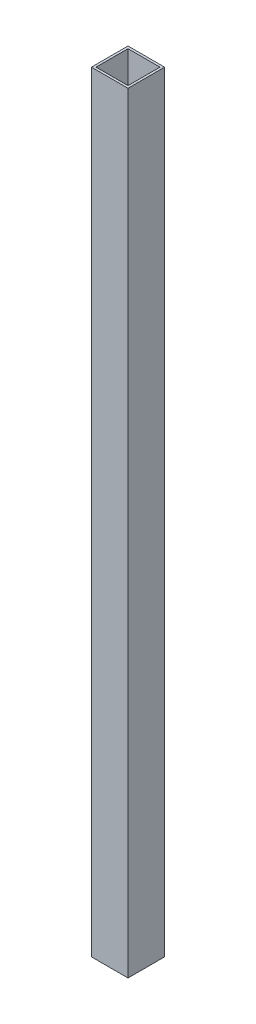
ISO-10303-21;
HEADER;
FILE_DESCRIPTION(('STEP AP214'),'2;1');
FILE_NAME('part.step','',(''),(''),'','','');
FILE_SCHEMA(('AUTOMOTIVE_DESIGN { 1 0 10303 214 1 1 1 1 }'));
ENDSEC;
DATA;
#1=APPLICATION_CONTEXT('core data for automotive mechanical design processes');
#2=APPLICATION_PROTOCOL_DEFINITION('international standard','automotive_design',2000,#1);
#3=PRODUCT_CONTEXT('',#1,'mechanical');
#4=PRODUCT('Part','Part','',(#3));
#5=PRODUCT_RELATED_PRODUCT_CATEGORY('part','',(#4));
#6=PRODUCT_DEFINITION_FORMATION('','',#4);
#7=PRODUCT_DEFINITION_CONTEXT('part definition',#1,'design');
#8=PRODUCT_DEFINITION('design','',#6,#7);
#9=PRODUCT_DEFINITION_SHAPE('','',#8);
#10=(LENGTH_UNIT() NAMED_UNIT(*) SI_UNIT(.MILLI.,.METRE.));
#11=(NAMED_UNIT(*) PLANE_ANGLE_UNIT() SI_UNIT($,.RADIAN.));
#12=(NAMED_UNIT(*) SI_UNIT($,.STERADIAN.) SOLID_ANGLE_UNIT());
#13=UNCERTAINTY_MEASURE_WITH_UNIT(LENGTH_MEASURE(1.E-05),#10,'distance_accuracy_value','');
#14=(GEOMETRIC_REPRESENTATION_CONTEXT(3) GLOBAL_UNCERTAINTY_ASSIGNED_CONTEXT((#13)) GLOBAL_UNIT_ASSIGNED_CONTEXT((#10,
#11,#12)) REPRESENTATION_CONTEXT('',''));
#15=CARTESIAN_POINT('',(0.,0.,0.));
#16=DIRECTION('',(0.,0.,1.));
#17=DIRECTION('',(1.,0.,0.));
#18=AXIS2_PLACEMENT_3D('',#15,#16,#17);
#19=CARTESIAN_POINT('',(0.,400.,0.));
#20=DIRECTION('',(0.,1.,0.));
#21=DIRECTION('',(0.,0.,1.));
#22=AXIS2_PLACEMENT_3D('',#19,#20,#21);
#23=PLANE('',#22);
#24=DIRECTION('',(0.,0.,1.));
#25=VECTOR('',#24,1.);
#26=CARTESIAN_POINT('',(0.,400.,0.));
#27=LINE('',#26,#25);
#28=CARTESIAN_POINT('',(0.,400.,0.));
#29=VERTEX_POINT('',#28);
#30=CARTESIAN_POINT('',(0.,400.,19.));
#31=VERTEX_POINT('',#30);
#32=EDGE_CURVE('E134',#29,#31,#27,.T.);
#33=ORIENTED_EDGE('',*,*,#32,.T.);
#34=DIRECTION('',(1.,0.,0.));
#35=VECTOR('',#34,1.);
#36=CARTESIAN_POINT('',(0.,400.,19.));
#37=LINE('',#36,#35);
#38=CARTESIAN_POINT('',(19.,400.,19.));
#39=VERTEX_POINT('',#38);
#40=EDGE_CURVE('E137',#31,#39,#37,.T.);
#41=ORIENTED_EDGE('',*,*,#40,.T.);
#42=DIRECTION('',(0.,0.,-1.));
#43=VECTOR('',#42,1.);
#44=CARTESIAN_POINT('',(19.,400.,0.));
#45=LINE('',#44,#43);
#46=CARTESIAN_POINT('',(19.,400.,0.));
#47=VERTEX_POINT('',#46);
#48=EDGE_CURVE('E140',#39,#47,#45,.T.);
#49=ORIENTED_EDGE('',*,*,#48,.T.);
#50=DIRECTION('',(-1.,0.,0.));
#51=VECTOR('',#50,1.);
#52=CARTESIAN_POINT('',(0.,400.,0.));
#53=LINE('',#52,#51);
#54=EDGE_CURVE('E142',#47,#29,#53,.T.);
#55=ORIENTED_EDGE('',*,*,#54,.T.);
#56=EDGE_LOOP('',(#33,#41,#49,#55));
#57=FACE_BOUND('',#56,.T.);
#58=DIRECTION('',(1.,0.,0.));
#59=VECTOR('',#58,1.);
#60=CARTESIAN_POINT('',(1.2,400.,17.8));
#61=LINE('',#60,#59);
#62=CARTESIAN_POINT('',(1.2,400.,17.8));
#63=VERTEX_POINT('',#62);
#64=CARTESIAN_POINT('',(17.8,400.,17.8));
#65=VERTEX_POINT('',#64);
#66=EDGE_CURVE('E106',#63,#65,#61,.T.);
#67=ORIENTED_EDGE('',*,*,#66,.F.);
#68=DIRECTION('',(0.,0.,1.));
#69=VECTOR('',#68,1.);
#70=CARTESIAN_POINT('',(1.2,400.,1.2));
#71=LINE('',#70,#69);
#72=CARTESIAN_POINT('',(1.2,400.,1.2));
#73=VERTEX_POINT('',#72);
#74=EDGE_CURVE('E98',#73,#63,#71,.T.);
#75=ORIENTED_EDGE('',*,*,#74,.F.);
#76=DIRECTION('',(-1.,0.,0.));
#77=VECTOR('',#76,1.);
#78=CARTESIAN_POINT('',(1.2,400.,1.2));
#79=LINE('',#78,#77);
#80=CARTESIAN_POINT('',(17.8,400.,1.2));
#81=VERTEX_POINT('',#80);
#82=EDGE_CURVE('E120',#81,#73,#79,.T.);
#83=ORIENTED_EDGE('',*,*,#82,.F.);
#84=DIRECTION('',(0.,0.,-1.));
#85=VECTOR('',#84,1.);
#86=CARTESIAN_POINT('',(17.8,400.,1.2));
#87=LINE('',#86,#85);
#88=EDGE_CURVE('E118',#65,#81,#87,.T.);
#89=ORIENTED_EDGE('',*,*,#88,.F.);
#90=EDGE_LOOP('',(#67,#75,#83,#89));
#91=FACE_BOUND('',#90,.T.);
#92=ADVANCED_FACE('F33',(#57,#91),#23,.T.);
#93=CARTESIAN_POINT('',(0.,0.,0.));
#94=DIRECTION('',(0.,1.,0.));
#95=DIRECTION('',(0.,0.,1.));
#96=AXIS2_PLACEMENT_3D('',#93,#94,#95);
#97=PLANE('',#96);
#98=DIRECTION('',(0.,0.,1.));
#99=VECTOR('',#98,1.);
#100=CARTESIAN_POINT('',(0.,0.,0.));
#101=LINE('',#100,#99);
#102=CARTESIAN_POINT('',(0.,0.,0.));
#103=VERTEX_POINT('',#102);
#104=CARTESIAN_POINT('',(0.,0.,19.));
#105=VERTEX_POINT('',#104);
#106=EDGE_CURVE('E114',#103,#105,#101,.T.);
#107=ORIENTED_EDGE('',*,*,#106,.F.);
#108=DIRECTION('',(-1.,0.,0.));
#109=VECTOR('',#108,1.);
#110=CARTESIAN_POINT('',(0.,0.,0.));
#111=LINE('',#110,#109);
#112=CARTESIAN_POINT('',(19.,0.,0.));
#113=VERTEX_POINT('',#112);
#114=EDGE_CURVE('E138',#113,#103,#111,.T.);
#115=ORIENTED_EDGE('',*,*,#114,.F.);
#116=DIRECTION('',(0.,0.,-1.));
#117=VECTOR('',#116,1.);
#118=CARTESIAN_POINT('',(19.,0.,0.));
#119=LINE('',#118,#117);
#120=CARTESIAN_POINT('',(19.,0.,19.));
#121=VERTEX_POINT('',#120);
#122=EDGE_CURVE('E149',#121,#113,#119,.T.);
#123=ORIENTED_EDGE('',*,*,#122,.F.);
#124=DIRECTION('',(1.,0.,0.));
#125=VECTOR('',#124,1.);
#126=CARTESIAN_POINT('',(0.,0.,19.));
#127=LINE('',#126,#125);
#128=EDGE_CURVE('E147',#105,#121,#127,.T.);
#129=ORIENTED_EDGE('',*,*,#128,.F.);
#130=EDGE_LOOP('',(#107,#115,#123,#129));
#131=FACE_BOUND('',#130,.T.);
#132=DIRECTION('',(0.,0.,1.));
#133=VECTOR('',#132,1.);
#134=CARTESIAN_POINT('',(1.2,0.,1.2));
#135=LINE('',#134,#133);
#136=CARTESIAN_POINT('',(1.2,0.,1.2));
#137=VERTEX_POINT('',#136);
#138=CARTESIAN_POINT('',(1.2,0.,17.8));
#139=VERTEX_POINT('',#138);
#140=EDGE_CURVE('E56',#137,#139,#135,.T.);
#141=ORIENTED_EDGE('',*,*,#140,.T.);
#142=DIRECTION('',(1.,0.,0.));
#143=VECTOR('',#142,1.);
#144=CARTESIAN_POINT('',(1.2,0.,17.8));
#145=LINE('',#144,#143);
#146=CARTESIAN_POINT('',(17.8,0.,17.8));
#147=VERTEX_POINT('',#146);
#148=EDGE_CURVE('E113',#139,#147,#145,.T.);
#149=ORIENTED_EDGE('',*,*,#148,.T.);
#150=DIRECTION('',(0.,0.,-1.));
#151=VECTOR('',#150,1.);
#152=CARTESIAN_POINT('',(17.8,0.,1.2));
#153=LINE('',#152,#151);
#154=CARTESIAN_POINT('',(17.8,0.,1.2));
#155=VERTEX_POINT('',#154);
#156=EDGE_CURVE('E126',#147,#155,#153,.T.);
#157=ORIENTED_EDGE('',*,*,#156,.T.);
#158=DIRECTION('',(-1.,0.,0.));
#159=VECTOR('',#158,1.);
#160=CARTESIAN_POINT('',(1.2,0.,1.2));
#161=LINE('',#160,#159);
#162=EDGE_CURVE('E107',#155,#137,#161,.T.);
#163=ORIENTED_EDGE('',*,*,#162,.T.);
#164=EDGE_LOOP('',(#141,#149,#157,#163));
#165=FACE_BOUND('',#164,.T.);
#166=ADVANCED_FACE('F167',(#131,#165),#97,.F.);
#167=CARTESIAN_POINT('',(0.,400.,0.));
#168=DIRECTION('',(1.,0.,0.));
#169=DIRECTION('',(0.,0.,-1.));
#170=AXIS2_PLACEMENT_3D('',#167,#168,#169);
#171=PLANE('',#170);
#172=ORIENTED_EDGE('',*,*,#106,.T.);
#173=DIRECTION('',(0.,-1.,0.));
#174=VECTOR('',#173,1.);
#175=CARTESIAN_POINT('',(0.,400.,19.));
#176=LINE('',#175,#174);
#177=EDGE_CURVE('E11',#31,#105,#176,.T.);
#178=ORIENTED_EDGE('',*,*,#177,.F.);
#179=ORIENTED_EDGE('',*,*,#32,.F.);
#180=DIRECTION('',(0.,-1.,0.));
#181=VECTOR('',#180,1.);
#182=CARTESIAN_POINT('',(0.,400.,0.));
#183=LINE('',#182,#181);
#184=EDGE_CURVE('E144',#29,#103,#183,.T.);
#185=ORIENTED_EDGE('',*,*,#184,.T.);
#186=EDGE_LOOP('',(#172,#178,#179,#185));
#187=FACE_BOUND('',#186,.T.);
#188=ADVANCED_FACE('F35',(#187),#171,.F.);
#189=CARTESIAN_POINT('',(0.,400.,19.));
#190=DIRECTION('',(0.,0.,-1.));
#191=DIRECTION('',(-1.,0.,0.));
#192=AXIS2_PLACEMENT_3D('',#189,#190,#191);
#193=PLANE('',#192);
#194=ORIENTED_EDGE('',*,*,#128,.T.);
#195=DIRECTION('',(0.,-1.,0.));
#196=VECTOR('',#195,1.);
#197=CARTESIAN_POINT('',(19.,400.,19.));
#198=LINE('',#197,#196);
#199=EDGE_CURVE('E41',#39,#121,#198,.T.);
#200=ORIENTED_EDGE('',*,*,#199,.F.);
#201=ORIENTED_EDGE('',*,*,#40,.F.);
#202=ORIENTED_EDGE('',*,*,#177,.T.);
#203=EDGE_LOOP('',(#194,#200,#201,#202));
#204=FACE_BOUND('',#203,.T.);
#205=ADVANCED_FACE('F177',(#204),#193,.F.);
#206=CARTESIAN_POINT('',(19.,400.,0.));
#207=DIRECTION('',(-1.,0.,0.));
#208=DIRECTION('',(0.,0.,1.));
#209=AXIS2_PLACEMENT_3D('',#206,#207,#208);
#210=PLANE('',#209);
#211=ORIENTED_EDGE('',*,*,#122,.T.);
#212=DIRECTION('',(0.,-1.,0.));
#213=VECTOR('',#212,1.);
#214=CARTESIAN_POINT('',(19.,400.,0.));
#215=LINE('',#214,#213);
#216=EDGE_CURVE('E154',#47,#113,#215,.T.);
#217=ORIENTED_EDGE('',*,*,#216,.F.);
#218=ORIENTED_EDGE('',*,*,#48,.F.);
#219=ORIENTED_EDGE('',*,*,#199,.T.);
#220=EDGE_LOOP('',(#211,#217,#218,#219));
#221=FACE_BOUND('',#220,.T.);
#222=ADVANCED_FACE('F161',(#221),#210,.F.);
#223=CARTESIAN_POINT('',(0.,400.,0.));
#224=DIRECTION('',(0.,0.,1.));
#225=DIRECTION('',(1.,0.,0.));
#226=AXIS2_PLACEMENT_3D('',#223,#224,#225);
#227=PLANE('',#226);
#228=ORIENTED_EDGE('',*,*,#114,.T.);
#229=ORIENTED_EDGE('',*,*,#184,.F.);
#230=ORIENTED_EDGE('',*,*,#54,.F.);
#231=ORIENTED_EDGE('',*,*,#216,.T.);
#232=EDGE_LOOP('',(#228,#229,#230,#231));
#233=FACE_BOUND('',#232,.T.);
#234=ADVANCED_FACE('F171',(#233),#227,.F.);
#235=CARTESIAN_POINT('',(1.2,400.,1.2));
#236=DIRECTION('',(1.,0.,0.));
#237=DIRECTION('',(0.,0.,-1.));
#238=AXIS2_PLACEMENT_3D('',#235,#236,#237);
#239=PLANE('',#238);
#240=ORIENTED_EDGE('',*,*,#140,.F.);
#241=DIRECTION('',(0.,-1.,0.));
#242=VECTOR('',#241,1.);
#243=CARTESIAN_POINT('',(1.2,400.,1.2));
#244=LINE('',#243,#242);
#245=EDGE_CURVE('E102',#73,#137,#244,.T.);
#246=ORIENTED_EDGE('',*,*,#245,.F.);
#247=ORIENTED_EDGE('',*,*,#74,.T.);
#248=DIRECTION('',(0.,-1.,0.));
#249=VECTOR('',#248,1.);
#250=CARTESIAN_POINT('',(1.2,400.,17.8));
#251=LINE('',#250,#249);
#252=EDGE_CURVE('E101',#63,#139,#251,.T.);
#253=ORIENTED_EDGE('',*,*,#252,.T.);
#254=EDGE_LOOP('',(#240,#246,#247,#253));
#255=FACE_BOUND('',#254,.T.);
#256=ADVANCED_FACE('F100',(#255),#239,.T.);
#257=CARTESIAN_POINT('',(1.2,400.,17.8));
#258=DIRECTION('',(0.,0.,-1.));
#259=DIRECTION('',(-1.,0.,0.));
#260=AXIS2_PLACEMENT_3D('',#257,#258,#259);
#261=PLANE('',#260);
#262=ORIENTED_EDGE('',*,*,#148,.F.);
#263=ORIENTED_EDGE('',*,*,#252,.F.);
#264=ORIENTED_EDGE('',*,*,#66,.T.);
#265=DIRECTION('',(0.,-1.,0.));
#266=VECTOR('',#265,1.);
#267=CARTESIAN_POINT('',(17.8,400.,17.8));
#268=LINE('',#267,#266);
#269=EDGE_CURVE('E115',#65,#147,#268,.T.);
#270=ORIENTED_EDGE('',*,*,#269,.T.);
#271=EDGE_LOOP('',(#262,#263,#264,#270));
#272=FACE_BOUND('',#271,.T.);
#273=ADVANCED_FACE('F110',(#272),#261,.T.);
#274=CARTESIAN_POINT('',(17.8,400.,1.2));
#275=DIRECTION('',(-1.,0.,0.));
#276=DIRECTION('',(0.,0.,1.));
#277=AXIS2_PLACEMENT_3D('',#274,#275,#276);
#278=PLANE('',#277);
#279=ORIENTED_EDGE('',*,*,#156,.F.);
#280=ORIENTED_EDGE('',*,*,#269,.F.);
#281=ORIENTED_EDGE('',*,*,#88,.T.);
#282=DIRECTION('',(0.,-1.,0.));
#283=VECTOR('',#282,1.);
#284=CARTESIAN_POINT('',(17.8,400.,1.2));
#285=LINE('',#284,#283);
#286=EDGE_CURVE('E48',#81,#155,#285,.T.);
#287=ORIENTED_EDGE('',*,*,#286,.T.);
#288=EDGE_LOOP('',(#279,#280,#281,#287));
#289=FACE_BOUND('',#288,.T.);
#290=ADVANCED_FACE('F200',(#289),#278,.T.);
#291=CARTESIAN_POINT('',(1.2,400.,1.2));
#292=DIRECTION('',(0.,0.,1.));
#293=DIRECTION('',(1.,0.,0.));
#294=AXIS2_PLACEMENT_3D('',#291,#292,#293);
#295=PLANE('',#294);
#296=ORIENTED_EDGE('',*,*,#162,.F.);
#297=ORIENTED_EDGE('',*,*,#286,.F.);
#298=ORIENTED_EDGE('',*,*,#82,.T.);
#299=ORIENTED_EDGE('',*,*,#245,.T.);
#300=EDGE_LOOP('',(#296,#297,#298,#299));
#301=FACE_BOUND('',#300,.T.);
#302=ADVANCED_FACE('F204',(#301),#295,.T.);
#303=CLOSED_SHELL('',(#92,#166,#188,#205,#222,#234,#256,#273,#290,#302));
#304=MANIFOLD_SOLID_BREP('B2',#303);
#305=ADVANCED_BREP_SHAPE_REPRESENTATION('',(#18,#304),#14);
#306=SHAPE_DEFINITION_REPRESENTATION(#9,#305);
ENDSEC;
END-ISO-10303-21;
